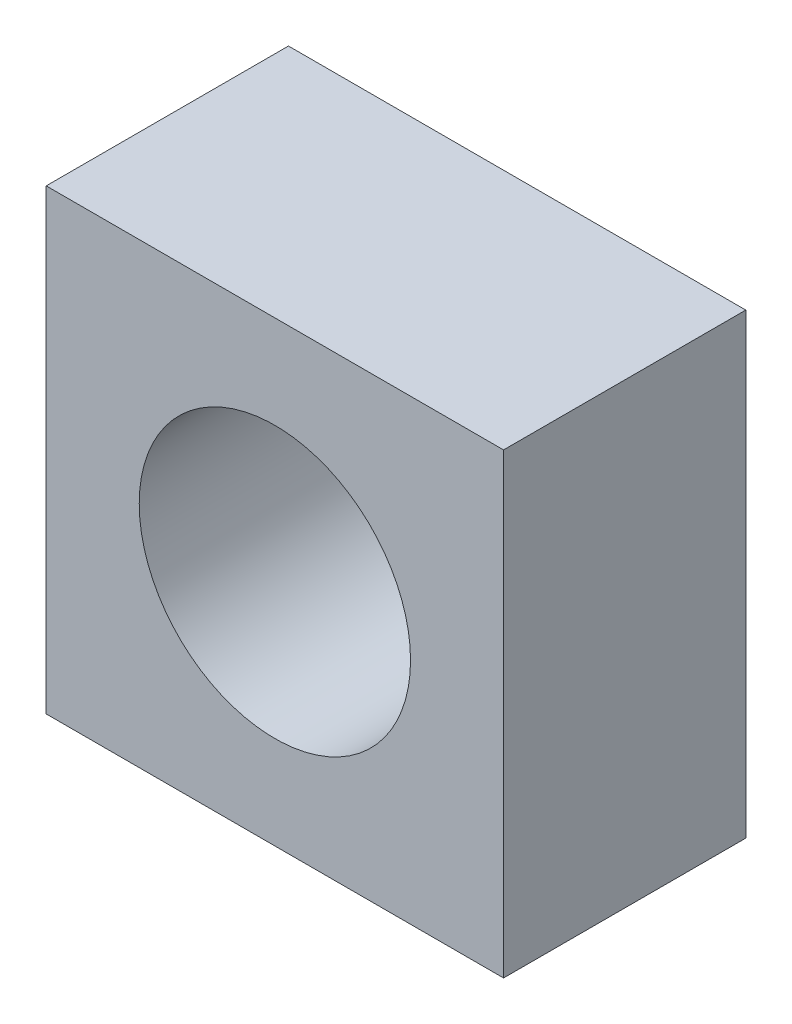
ISO-10303-21;
HEADER;
FILE_DESCRIPTION(('STEP AP214'),'2;1');
FILE_NAME('part.step','',(''),(''),'','','');
FILE_SCHEMA(('AUTOMOTIVE_DESIGN { 1 0 10303 214 1 1 1 1 }'));
ENDSEC;
DATA;
#1=APPLICATION_CONTEXT('core data for automotive mechanical design processes');
#2=APPLICATION_PROTOCOL_DEFINITION('international standard','automotive_design',2000,#1);
#3=PRODUCT_CONTEXT('',#1,'mechanical');
#4=PRODUCT('Part','Part','',(#3));
#5=PRODUCT_RELATED_PRODUCT_CATEGORY('part','',(#4));
#6=PRODUCT_DEFINITION_FORMATION('','',#4);
#7=PRODUCT_DEFINITION_CONTEXT('part definition',#1,'design');
#8=PRODUCT_DEFINITION('design','',#6,#7);
#9=PRODUCT_DEFINITION_SHAPE('','',#8);
#10=(LENGTH_UNIT() NAMED_UNIT(*) SI_UNIT(.MILLI.,.METRE.));
#11=(NAMED_UNIT(*) PLANE_ANGLE_UNIT() SI_UNIT($,.RADIAN.));
#12=(NAMED_UNIT(*) SI_UNIT($,.STERADIAN.) SOLID_ANGLE_UNIT());
#13=UNCERTAINTY_MEASURE_WITH_UNIT(LENGTH_MEASURE(1.E-05),#10,'distance_accuracy_value','');
#14=(GEOMETRIC_REPRESENTATION_CONTEXT(3) GLOBAL_UNCERTAINTY_ASSIGNED_CONTEXT((#13)) GLOBAL_UNIT_ASSIGNED_CONTEXT((#10,
#11,#12)) REPRESENTATION_CONTEXT('',''));
#15=CARTESIAN_POINT('',(0.,0.,0.));
#16=DIRECTION('',(0.,0.,1.));
#17=DIRECTION('',(1.,0.,0.));
#18=AXIS2_PLACEMENT_3D('',#15,#16,#17);
#19=CARTESIAN_POINT('',(-2.9972,-2.9972,3.175));
#20=DIRECTION('',(1.,0.,0.));
#21=DIRECTION('',(0.,0.,-1.));
#22=AXIS2_PLACEMENT_3D('',#19,#20,#21);
#23=PLANE('',#22);
#24=DIRECTION('',(0.,-1.,0.));
#25=VECTOR('',#24,1.);
#26=CARTESIAN_POINT('',(-2.9972,-2.9972,0.));
#27=LINE('',#26,#25);
#28=CARTESIAN_POINT('',(-2.9972,2.9972,0.));
#29=VERTEX_POINT('',#28);
#30=CARTESIAN_POINT('',(-2.9972,-2.9972,0.));
#31=VERTEX_POINT('',#30);
#32=EDGE_CURVE('E97',#29,#31,#27,.T.);
#33=ORIENTED_EDGE('',*,*,#32,.T.);
#34=DIRECTION('',(0.,0.,-1.));
#35=VECTOR('',#34,1.);
#36=CARTESIAN_POINT('',(-2.9972,-2.9972,3.175));
#37=LINE('',#36,#35);
#38=CARTESIAN_POINT('',(-2.9972,-2.9972,3.175));
#39=VERTEX_POINT('',#38);
#40=EDGE_CURVE('E11',#39,#31,#37,.T.);
#41=ORIENTED_EDGE('',*,*,#40,.F.);
#42=DIRECTION('',(0.,-1.,0.));
#43=VECTOR('',#42,1.);
#44=CARTESIAN_POINT('',(-2.9972,-2.9972,3.175));
#45=LINE('',#44,#43);
#46=CARTESIAN_POINT('',(-2.9972,2.9972,3.175));
#47=VERTEX_POINT('',#46);
#48=EDGE_CURVE('E85',#47,#39,#45,.T.);
#49=ORIENTED_EDGE('',*,*,#48,.F.);
#50=DIRECTION('',(0.,0.,-1.));
#51=VECTOR('',#50,1.);
#52=CARTESIAN_POINT('',(-2.9972,2.9972,3.175));
#53=LINE('',#52,#51);
#54=EDGE_CURVE('E93',#47,#29,#53,.T.);
#55=ORIENTED_EDGE('',*,*,#54,.T.);
#56=EDGE_LOOP('',(#33,#41,#49,#55));
#57=FACE_BOUND('',#56,.T.);
#58=ADVANCED_FACE('F34',(#57),#23,.F.);
#59=CARTESIAN_POINT('',(2.9972,-2.9972,3.175));
#60=DIRECTION('',(0.,1.,0.));
#61=DIRECTION('',(-1.,0.,0.));
#62=AXIS2_PLACEMENT_3D('',#59,#60,#61);
#63=PLANE('',#62);
#64=DIRECTION('',(1.,0.,0.));
#65=VECTOR('',#64,1.);
#66=CARTESIAN_POINT('',(2.9972,-2.9972,0.));
#67=LINE('',#66,#65);
#68=CARTESIAN_POINT('',(2.9972,-2.9972,0.));
#69=VERTEX_POINT('',#68);
#70=EDGE_CURVE('E89',#31,#69,#67,.T.);
#71=ORIENTED_EDGE('',*,*,#70,.T.);
#72=DIRECTION('',(0.,0.,-1.));
#73=VECTOR('',#72,1.);
#74=CARTESIAN_POINT('',(2.9972,-2.9972,3.175));
#75=LINE('',#74,#73);
#76=CARTESIAN_POINT('',(2.9972,-2.9972,3.175));
#77=VERTEX_POINT('',#76);
#78=EDGE_CURVE('E42',#77,#69,#75,.T.);
#79=ORIENTED_EDGE('',*,*,#78,.F.);
#80=DIRECTION('',(1.,0.,0.));
#81=VECTOR('',#80,1.);
#82=CARTESIAN_POINT('',(2.9972,-2.9972,3.175));
#83=LINE('',#82,#81);
#84=EDGE_CURVE('E80',#39,#77,#83,.T.);
#85=ORIENTED_EDGE('',*,*,#84,.F.);
#86=ORIENTED_EDGE('',*,*,#40,.T.);
#87=EDGE_LOOP('',(#71,#79,#85,#86));
#88=FACE_BOUND('',#87,.T.);
#89=ADVANCED_FACE('F88',(#88),#63,.F.);
#90=CARTESIAN_POINT('',(2.9972,-2.9972,3.175));
#91=DIRECTION('',(-1.,0.,0.));
#92=DIRECTION('',(0.,0.,1.));
#93=AXIS2_PLACEMENT_3D('',#90,#91,#92);
#94=PLANE('',#93);
#95=DIRECTION('',(0.,1.,0.));
#96=VECTOR('',#95,1.);
#97=CARTESIAN_POINT('',(2.9972,-2.9972,0.));
#98=LINE('',#97,#96);
#99=CARTESIAN_POINT('',(2.9972,2.9972,0.));
#100=VERTEX_POINT('',#99);
#101=EDGE_CURVE('E67',#69,#100,#98,.T.);
#102=ORIENTED_EDGE('',*,*,#101,.T.);
#103=DIRECTION('',(0.,0.,-1.));
#104=VECTOR('',#103,1.);
#105=CARTESIAN_POINT('',(2.9972,2.9972,3.175));
#106=LINE('',#105,#104);
#107=CARTESIAN_POINT('',(2.9972,2.9972,3.175));
#108=VERTEX_POINT('',#107);
#109=EDGE_CURVE('E90',#108,#100,#106,.T.);
#110=ORIENTED_EDGE('',*,*,#109,.F.);
#111=DIRECTION('',(0.,1.,0.));
#112=VECTOR('',#111,1.);
#113=CARTESIAN_POINT('',(2.9972,-2.9972,3.175));
#114=LINE('',#113,#112);
#115=EDGE_CURVE('E83',#77,#108,#114,.T.);
#116=ORIENTED_EDGE('',*,*,#115,.F.);
#117=ORIENTED_EDGE('',*,*,#78,.T.);
#118=EDGE_LOOP('',(#102,#110,#116,#117));
#119=FACE_BOUND('',#118,.T.);
#120=ADVANCED_FACE('F91',(#119),#94,.F.);
#121=CARTESIAN_POINT('',(2.9972,2.9972,3.175));
#122=DIRECTION('',(0.,-1.,0.));
#123=DIRECTION('',(1.,0.,0.));
#124=AXIS2_PLACEMENT_3D('',#121,#122,#123);
#125=PLANE('',#124);
#126=DIRECTION('',(-1.,0.,0.));
#127=VECTOR('',#126,1.);
#128=CARTESIAN_POINT('',(2.9972,2.9972,0.));
#129=LINE('',#128,#127);
#130=EDGE_CURVE('E73',#100,#29,#129,.T.);
#131=ORIENTED_EDGE('',*,*,#130,.T.);
#132=ORIENTED_EDGE('',*,*,#54,.F.);
#133=DIRECTION('',(-1.,0.,0.));
#134=VECTOR('',#133,1.);
#135=CARTESIAN_POINT('',(2.9972,2.9972,3.175));
#136=LINE('',#135,#134);
#137=EDGE_CURVE('E50',#108,#47,#136,.T.);
#138=ORIENTED_EDGE('',*,*,#137,.F.);
#139=ORIENTED_EDGE('',*,*,#109,.T.);
#140=EDGE_LOOP('',(#131,#132,#138,#139));
#141=FACE_BOUND('',#140,.T.);
#142=ADVANCED_FACE('F105',(#141),#125,.F.);
#143=CARTESIAN_POINT('',(0.,0.,3.175));
#144=DIRECTION('',(0.,0.,1.));
#145=DIRECTION('',(1.,0.,0.));
#146=AXIS2_PLACEMENT_3D('',#143,#144,#145);
#147=PLANE('',#146);
#148=CARTESIAN_POINT('',(0.,0.,3.175));
#149=DIRECTION('',(0.,0.,1.));
#150=DIRECTION('',(1.,0.,0.));
#151=AXIS2_PLACEMENT_3D('',#148,#149,#150);
#152=CIRCLE('',#151,1.778);
#153=CARTESIAN_POINT('',(1.778,0.,3.175));
#154=VERTEX_POINT('',#153);
#155=EDGE_CURVE('E111',#154,#154,#152,.T.);
#156=ORIENTED_EDGE('',*,*,#155,.F.);
#157=EDGE_LOOP('',(#156));
#158=FACE_BOUND('',#157,.T.);
#159=ORIENTED_EDGE('',*,*,#48,.T.);
#160=ORIENTED_EDGE('',*,*,#84,.T.);
#161=ORIENTED_EDGE('',*,*,#115,.T.);
#162=ORIENTED_EDGE('',*,*,#137,.T.);
#163=EDGE_LOOP('',(#159,#160,#161,#162));
#164=FACE_BOUND('',#163,.T.);
#165=ADVANCED_FACE('F81',(#158,#164),#147,.T.);
#166=CARTESIAN_POINT('',(0.,0.,0.));
#167=DIRECTION('',(0.,0.,1.));
#168=DIRECTION('',(1.,0.,0.));
#169=AXIS2_PLACEMENT_3D('',#166,#167,#168);
#170=PLANE('',#169);
#171=CARTESIAN_POINT('',(0.,0.,0.));
#172=DIRECTION('',(0.,0.,1.));
#173=DIRECTION('',(1.,0.,0.));
#174=AXIS2_PLACEMENT_3D('',#171,#172,#173);
#175=CIRCLE('',#174,1.778);
#176=CARTESIAN_POINT('',(1.778,0.,0.));
#177=VERTEX_POINT('',#176);
#178=EDGE_CURVE('E100',#177,#177,#175,.T.);
#179=ORIENTED_EDGE('',*,*,#178,.T.);
#180=EDGE_LOOP('',(#179));
#181=FACE_BOUND('',#180,.T.);
#182=ORIENTED_EDGE('',*,*,#32,.F.);
#183=ORIENTED_EDGE('',*,*,#130,.F.);
#184=ORIENTED_EDGE('',*,*,#101,.F.);
#185=ORIENTED_EDGE('',*,*,#70,.F.);
#186=EDGE_LOOP('',(#182,#183,#184,#185));
#187=FACE_BOUND('',#186,.T.);
#188=ADVANCED_FACE('F108',(#181,#187),#170,.F.);
#189=CARTESIAN_POINT('',(0.,0.,0.));
#190=DIRECTION('',(0.,0.,1.));
#191=DIRECTION('',(1.,0.,0.));
#192=AXIS2_PLACEMENT_3D('',#189,#190,#191);
#193=CYLINDRICAL_SURFACE('',#192,1.778);
#194=ORIENTED_EDGE('',*,*,#178,.F.);
#195=EDGE_LOOP('',(#194));
#196=FACE_BOUND('',#195,.T.);
#197=ORIENTED_EDGE('',*,*,#155,.T.);
#198=EDGE_LOOP('',(#197));
#199=FACE_BOUND('',#198,.T.);
#200=ADVANCED_FACE('F118',(#196,#199),#193,.F.);
#201=CLOSED_SHELL('',(#58,#89,#120,#142,#165,#188,#200));
#202=MANIFOLD_SOLID_BREP('B2',#201);
#203=ADVANCED_BREP_SHAPE_REPRESENTATION('',(#18,#202),#14);
#204=SHAPE_DEFINITION_REPRESENTATION(#9,#203);
ENDSEC;
END-ISO-10303-21;
